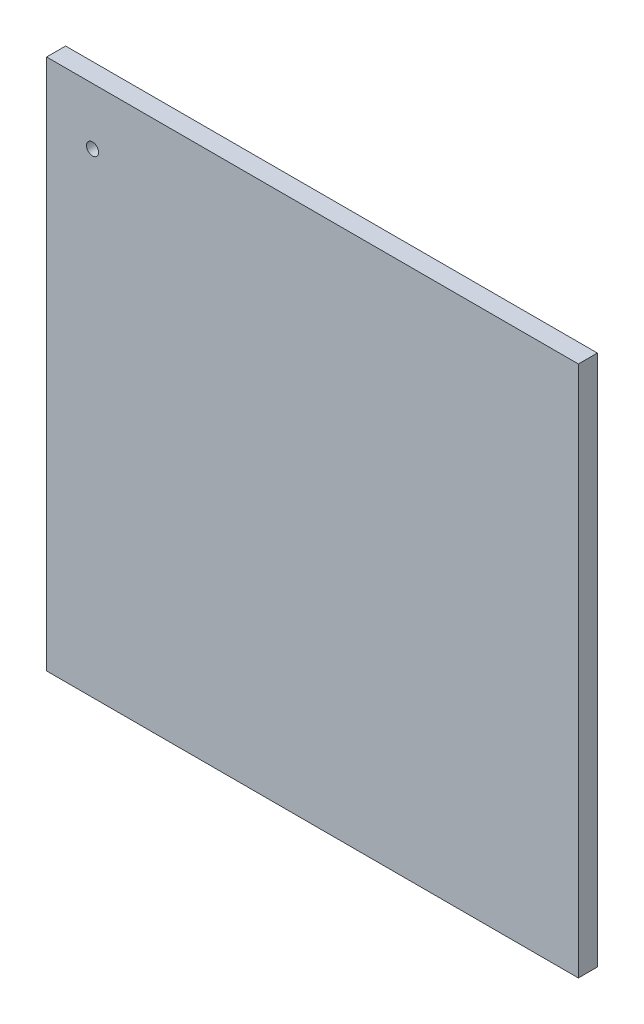
ISO-10303-21;
HEADER;
FILE_DESCRIPTION(('STEP AP214'),'2;1');
FILE_NAME('part.step','',(''),(''),'','','');
FILE_SCHEMA(('AUTOMOTIVE_DESIGN { 1 0 10303 214 1 1 1 1 }'));
ENDSEC;
DATA;
#1=APPLICATION_CONTEXT('core data for automotive mechanical design processes');
#2=APPLICATION_PROTOCOL_DEFINITION('international standard','automotive_design',2000,#1);
#3=PRODUCT_CONTEXT('',#1,'mechanical');
#4=PRODUCT('Part','Part','',(#3));
#5=PRODUCT_RELATED_PRODUCT_CATEGORY('part','',(#4));
#6=PRODUCT_DEFINITION_FORMATION('','',#4);
#7=PRODUCT_DEFINITION_CONTEXT('part definition',#1,'design');
#8=PRODUCT_DEFINITION('design','',#6,#7);
#9=PRODUCT_DEFINITION_SHAPE('','',#8);
#10=(LENGTH_UNIT() NAMED_UNIT(*) SI_UNIT(.MILLI.,.METRE.));
#11=(NAMED_UNIT(*) PLANE_ANGLE_UNIT() SI_UNIT($,.RADIAN.));
#12=(NAMED_UNIT(*) SI_UNIT($,.STERADIAN.) SOLID_ANGLE_UNIT());
#13=UNCERTAINTY_MEASURE_WITH_UNIT(LENGTH_MEASURE(1.E-05),#10,'distance_accuracy_value','');
#14=(GEOMETRIC_REPRESENTATION_CONTEXT(3) GLOBAL_UNCERTAINTY_ASSIGNED_CONTEXT((#13)) GLOBAL_UNIT_ASSIGNED_CONTEXT((#10,
#11,#12)) REPRESENTATION_CONTEXT('',''));
#15=CARTESIAN_POINT('',(0.,0.,0.));
#16=DIRECTION('',(0.,0.,1.));
#17=DIRECTION('',(1.,0.,0.));
#18=AXIS2_PLACEMENT_3D('',#15,#16,#17);
#19=CARTESIAN_POINT('',(-70.,-70.,5.));
#20=DIRECTION('',(1.,0.,0.));
#21=DIRECTION('',(0.,0.,-1.));
#22=AXIS2_PLACEMENT_3D('',#19,#20,#21);
#23=PLANE('',#22);
#24=DIRECTION('',(0.,-1.,0.));
#25=VECTOR('',#24,1.);
#26=CARTESIAN_POINT('',(-70.,-70.,0.));
#27=LINE('',#26,#25);
#28=CARTESIAN_POINT('',(-70.,70.,0.));
#29=VERTEX_POINT('',#28);
#30=CARTESIAN_POINT('',(-70.,-70.,0.));
#31=VERTEX_POINT('',#30);
#32=EDGE_CURVE('E105',#29,#31,#27,.T.);
#33=ORIENTED_EDGE('',*,*,#32,.T.);
#34=DIRECTION('',(0.,0.,-1.));
#35=VECTOR('',#34,1.);
#36=CARTESIAN_POINT('',(-70.,-70.,5.));
#37=LINE('',#36,#35);
#38=CARTESIAN_POINT('',(-70.,-70.,5.));
#39=VERTEX_POINT('',#38);
#40=EDGE_CURVE('E11',#39,#31,#37,.T.);
#41=ORIENTED_EDGE('',*,*,#40,.F.);
#42=DIRECTION('',(0.,-1.,0.));
#43=VECTOR('',#42,1.);
#44=CARTESIAN_POINT('',(-70.,-70.,5.));
#45=LINE('',#44,#43);
#46=CARTESIAN_POINT('',(-70.,70.,5.));
#47=VERTEX_POINT('',#46);
#48=EDGE_CURVE('E93',#47,#39,#45,.T.);
#49=ORIENTED_EDGE('',*,*,#48,.F.);
#50=DIRECTION('',(0.,0.,-1.));
#51=VECTOR('',#50,1.);
#52=CARTESIAN_POINT('',(-70.,70.,5.));
#53=LINE('',#52,#51);
#54=EDGE_CURVE('E101',#47,#29,#53,.T.);
#55=ORIENTED_EDGE('',*,*,#54,.T.);
#56=EDGE_LOOP('',(#33,#41,#49,#55));
#57=FACE_BOUND('',#56,.T.);
#58=ADVANCED_FACE('F42',(#57),#23,.F.);
#59=CARTESIAN_POINT('',(70.,-70.,5.));
#60=DIRECTION('',(0.,1.,0.));
#61=DIRECTION('',(-1.,0.,0.));
#62=AXIS2_PLACEMENT_3D('',#59,#60,#61);
#63=PLANE('',#62);
#64=DIRECTION('',(1.,0.,0.));
#65=VECTOR('',#64,1.);
#66=CARTESIAN_POINT('',(70.,-70.,0.));
#67=LINE('',#66,#65);
#68=CARTESIAN_POINT('',(70.,-70.,0.));
#69=VERTEX_POINT('',#68);
#70=EDGE_CURVE('E97',#31,#69,#67,.T.);
#71=ORIENTED_EDGE('',*,*,#70,.T.);
#72=DIRECTION('',(0.,0.,-1.));
#73=VECTOR('',#72,1.);
#74=CARTESIAN_POINT('',(70.,-70.,5.));
#75=LINE('',#74,#73);
#76=CARTESIAN_POINT('',(70.,-70.,5.));
#77=VERTEX_POINT('',#76);
#78=EDGE_CURVE('E50',#77,#69,#75,.T.);
#79=ORIENTED_EDGE('',*,*,#78,.F.);
#80=DIRECTION('',(1.,0.,0.));
#81=VECTOR('',#80,1.);
#82=CARTESIAN_POINT('',(70.,-70.,5.));
#83=LINE('',#82,#81);
#84=EDGE_CURVE('E88',#39,#77,#83,.T.);
#85=ORIENTED_EDGE('',*,*,#84,.F.);
#86=ORIENTED_EDGE('',*,*,#40,.T.);
#87=EDGE_LOOP('',(#71,#79,#85,#86));
#88=FACE_BOUND('',#87,.T.);
#89=ADVANCED_FACE('F96',(#88),#63,.F.);
#90=CARTESIAN_POINT('',(70.,-70.,5.));
#91=DIRECTION('',(-1.,0.,0.));
#92=DIRECTION('',(0.,0.,1.));
#93=AXIS2_PLACEMENT_3D('',#90,#91,#92);
#94=PLANE('',#93);
#95=DIRECTION('',(0.,1.,0.));
#96=VECTOR('',#95,1.);
#97=CARTESIAN_POINT('',(70.,-70.,0.));
#98=LINE('',#97,#96);
#99=CARTESIAN_POINT('',(70.,70.0000000000001,0.));
#100=VERTEX_POINT('',#99);
#101=EDGE_CURVE('E75',#69,#100,#98,.T.);
#102=ORIENTED_EDGE('',*,*,#101,.T.);
#103=DIRECTION('',(0.,0.,-1.));
#104=VECTOR('',#103,1.);
#105=CARTESIAN_POINT('',(70.,70.0000000000001,5.));
#106=LINE('',#105,#104);
#107=CARTESIAN_POINT('',(70.,70.0000000000001,5.));
#108=VERTEX_POINT('',#107);
#109=EDGE_CURVE('E98',#108,#100,#106,.T.);
#110=ORIENTED_EDGE('',*,*,#109,.F.);
#111=DIRECTION('',(0.,1.,0.));
#112=VECTOR('',#111,1.);
#113=CARTESIAN_POINT('',(70.,-70.,5.));
#114=LINE('',#113,#112);
#115=EDGE_CURVE('E91',#77,#108,#114,.T.);
#116=ORIENTED_EDGE('',*,*,#115,.F.);
#117=ORIENTED_EDGE('',*,*,#78,.T.);
#118=EDGE_LOOP('',(#102,#110,#116,#117));
#119=FACE_BOUND('',#118,.T.);
#120=ADVANCED_FACE('F99',(#119),#94,.F.);
#121=CARTESIAN_POINT('',(70.,70.0000000000001,5.));
#122=DIRECTION('',(0.,-1.,0.));
#123=DIRECTION('',(1.,0.,0.));
#124=AXIS2_PLACEMENT_3D('',#121,#122,#123);
#125=PLANE('',#124);
#126=DIRECTION('',(-1.,0.,0.));
#127=VECTOR('',#126,1.);
#128=CARTESIAN_POINT('',(70.,70.0000000000001,0.));
#129=LINE('',#128,#127);
#130=EDGE_CURVE('E81',#100,#29,#129,.T.);
#131=ORIENTED_EDGE('',*,*,#130,.T.);
#132=ORIENTED_EDGE('',*,*,#54,.F.);
#133=DIRECTION('',(-1.,0.,0.));
#134=VECTOR('',#133,1.);
#135=CARTESIAN_POINT('',(70.,70.0000000000001,5.));
#136=LINE('',#135,#134);
#137=EDGE_CURVE('E58',#108,#47,#136,.T.);
#138=ORIENTED_EDGE('',*,*,#137,.F.);
#139=ORIENTED_EDGE('',*,*,#109,.T.);
#140=EDGE_LOOP('',(#131,#132,#138,#139));
#141=FACE_BOUND('',#140,.T.);
#142=ADVANCED_FACE('F113',(#141),#125,.F.);
#143=CARTESIAN_POINT('',(0.,0.,5.));
#144=DIRECTION('',(0.,0.,1.));
#145=DIRECTION('',(1.,0.,0.));
#146=AXIS2_PLACEMENT_3D('',#143,#144,#145);
#147=PLANE('',#146);
#148=CARTESIAN_POINT('',(-57.91,55.0750000000001,5.));
#149=DIRECTION('',(0.,0.,1.));
#150=DIRECTION('',(1.,0.,0.));
#151=AXIS2_PLACEMENT_3D('',#148,#149,#150);
#152=CIRCLE('',#151,1.6);
#153=CARTESIAN_POINT('',(-56.31,55.0750000000001,5.));
#154=VERTEX_POINT('',#153);
#155=EDGE_CURVE('E119',#154,#154,#152,.T.);
#156=ORIENTED_EDGE('',*,*,#155,.F.);
#157=EDGE_LOOP('',(#156));
#158=FACE_BOUND('',#157,.T.);
#159=ORIENTED_EDGE('',*,*,#48,.T.);
#160=ORIENTED_EDGE('',*,*,#84,.T.);
#161=ORIENTED_EDGE('',*,*,#115,.T.);
#162=ORIENTED_EDGE('',*,*,#137,.T.);
#163=EDGE_LOOP('',(#159,#160,#161,#162));
#164=FACE_BOUND('',#163,.T.);
#165=ADVANCED_FACE('F89',(#158,#164),#147,.T.);
#166=CARTESIAN_POINT('',(0.,0.,0.));
#167=DIRECTION('',(0.,0.,1.));
#168=DIRECTION('',(1.,0.,0.));
#169=AXIS2_PLACEMENT_3D('',#166,#167,#168);
#170=PLANE('',#169);
#171=CARTESIAN_POINT('',(-57.91,55.0750000000001,0.));
#172=DIRECTION('',(0.,0.,1.));
#173=DIRECTION('',(1.,0.,0.));
#174=AXIS2_PLACEMENT_3D('',#171,#172,#173);
#175=CIRCLE('',#174,1.6);
#176=CARTESIAN_POINT('',(-56.31,55.0750000000001,0.));
#177=VERTEX_POINT('',#176);
#178=EDGE_CURVE('E108',#177,#177,#175,.T.);
#179=ORIENTED_EDGE('',*,*,#178,.T.);
#180=EDGE_LOOP('',(#179));
#181=FACE_BOUND('',#180,.T.);
#182=ORIENTED_EDGE('',*,*,#32,.F.);
#183=ORIENTED_EDGE('',*,*,#130,.F.);
#184=ORIENTED_EDGE('',*,*,#101,.F.);
#185=ORIENTED_EDGE('',*,*,#70,.F.);
#186=EDGE_LOOP('',(#182,#183,#184,#185));
#187=FACE_BOUND('',#186,.T.);
#188=ADVANCED_FACE('F116',(#181,#187),#170,.F.);
#189=CARTESIAN_POINT('',(-57.91,55.0750000000001,0.));
#190=DIRECTION('',(0.,0.,1.));
#191=DIRECTION('',(1.,0.,0.));
#192=AXIS2_PLACEMENT_3D('',#189,#190,#191);
#193=CYLINDRICAL_SURFACE('',#192,1.6);
#194=ORIENTED_EDGE('',*,*,#178,.F.);
#195=EDGE_LOOP('',(#194));
#196=FACE_BOUND('',#195,.T.);
#197=ORIENTED_EDGE('',*,*,#155,.T.);
#198=EDGE_LOOP('',(#197));
#199=FACE_BOUND('',#198,.T.);
#200=ADVANCED_FACE('F126',(#196,#199),#193,.F.);
#201=CLOSED_SHELL('',(#58,#89,#120,#142,#165,#188,#200));
#202=MANIFOLD_SOLID_BREP('B2',#201);
#203=ADVANCED_BREP_SHAPE_REPRESENTATION('',(#18,#202),#14);
#204=SHAPE_DEFINITION_REPRESENTATION(#9,#203);
ENDSEC;
END-ISO-10303-21;
